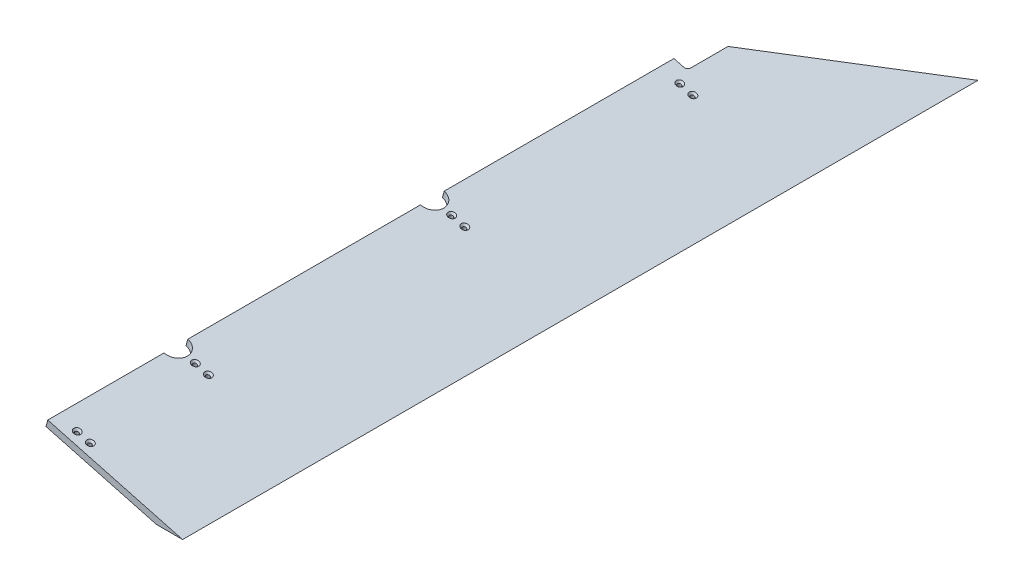
ISO-10303-21;
HEADER;
FILE_DESCRIPTION(('STEP AP214'),'2;1');
FILE_NAME('part.step','',(''),(''),'','','');
FILE_SCHEMA(('AUTOMOTIVE_DESIGN { 1 0 10303 214 1 1 1 1 }'));
ENDSEC;
DATA;
#1=APPLICATION_CONTEXT('core data for automotive mechanical design processes');
#2=APPLICATION_PROTOCOL_DEFINITION('international standard','automotive_design',2000,#1);
#3=PRODUCT_CONTEXT('',#1,'mechanical');
#4=PRODUCT('Part','Part','',(#3));
#5=PRODUCT_RELATED_PRODUCT_CATEGORY('part','',(#4));
#6=PRODUCT_DEFINITION_FORMATION('','',#4);
#7=PRODUCT_DEFINITION_CONTEXT('part definition',#1,'design');
#8=PRODUCT_DEFINITION('design','',#6,#7);
#9=PRODUCT_DEFINITION_SHAPE('','',#8);
#10=(LENGTH_UNIT() NAMED_UNIT(*) SI_UNIT(.MILLI.,.METRE.));
#11=(NAMED_UNIT(*) PLANE_ANGLE_UNIT() SI_UNIT($,.RADIAN.));
#12=(NAMED_UNIT(*) SI_UNIT($,.STERADIAN.) SOLID_ANGLE_UNIT());
#13=UNCERTAINTY_MEASURE_WITH_UNIT(LENGTH_MEASURE(1.E-05),#10,'distance_accuracy_value','');
#14=(GEOMETRIC_REPRESENTATION_CONTEXT(3) GLOBAL_UNCERTAINTY_ASSIGNED_CONTEXT((#13)) GLOBAL_UNIT_ASSIGNED_CONTEXT((#10,
#11,#12)) REPRESENTATION_CONTEXT('',''));
#15=CARTESIAN_POINT('',(0.,0.,0.));
#16=DIRECTION('',(0.,0.,1.));
#17=DIRECTION('',(1.,0.,0.));
#18=AXIS2_PLACEMENT_3D('',#15,#16,#17);
#19=CARTESIAN_POINT('',(25.512001872802,67.770934414059,1492.25));
#20=DIRECTION('',(0.965925826289068,-0.258819045102524,0.));
#21=DIRECTION('',(0.258819045102524,0.965925826289068,0.));
#22=AXIS2_PLACEMENT_3D('',#19,#20,#21);
#23=PLANE('',#22);
#24=DIRECTION('',(0.,0.,-1.));
#25=VECTOR('',#24,1.);
#26=CARTESIAN_POINT('',(25.512001872802,67.770934414059,1492.25));
#27=LINE('',#26,#25);
#28=CARTESIAN_POINT('',(25.5120018728021,67.770934414059,748.50625));
#29=VERTEX_POINT('',#28);
#30=CARTESIAN_POINT('',(25.512001872802,67.770934414059,317.5));
#31=VERTEX_POINT('',#30);
#32=EDGE_CURVE('E161',#29,#31,#27,.T.);
#33=ORIENTED_EDGE('',*,*,#32,.T.);
#34=DIRECTION('',(0.258819045102524,0.965925826289067,0.));
#35=VECTOR('',#34,1.);
#36=CARTESIAN_POINT('',(8.34908089495287,3.718041318437,317.5));
#37=LINE('',#36,#35);
#38=CARTESIAN_POINT('',(22.225,55.5036764201878,317.5));
#39=VERTEX_POINT('',#38);
#40=EDGE_CURVE('E218',#39,#31,#37,.T.);
#41=ORIENTED_EDGE('',*,*,#40,.F.);
#42=DIRECTION('',(0.,0.,-1.));
#43=VECTOR('',#42,1.);
#44=CARTESIAN_POINT('',(22.225,55.5036764201878,1492.25));
#45=LINE('',#44,#43);
#46=CARTESIAN_POINT('',(22.225,55.5036764201878,748.50625));
#47=VERTEX_POINT('',#46);
#48=EDGE_CURVE('E156',#47,#39,#45,.T.);
#49=ORIENTED_EDGE('',*,*,#48,.F.);
#50=DIRECTION('',(0.258819045102524,0.965925826289067,0.));
#51=VECTOR('',#50,1.);
#52=CARTESIAN_POINT('',(8.34908089495289,3.718041318437,748.50625));
#53=LINE('',#52,#51);
#54=EDGE_CURVE('E247',#47,#29,#53,.T.);
#55=ORIENTED_EDGE('',*,*,#54,.T.);
#56=EDGE_LOOP('',(#33,#41,#49,#55));
#57=FACE_BOUND('',#56,.T.);
#58=ADVANCED_FACE('F46',(#57),#23,.F.);
#59=CARTESIAN_POINT('',(25.5120018728021,67.770934414059,1229.51875));
#60=VERTEX_POINT('',#59);
#61=CARTESIAN_POINT('',(25.512001872802,67.770934414059,792.95625));
#62=VERTEX_POINT('',#61);
#63=EDGE_CURVE('E159',#60,#62,#27,.T.);
#64=ORIENTED_EDGE('',*,*,#63,.T.);
#65=DIRECTION('',(0.258819045102524,0.965925826289067,0.));
#66=VECTOR('',#65,1.);
#67=CARTESIAN_POINT('',(8.34908089495289,3.718041318437,792.95625));
#68=LINE('',#67,#66);
#69=CARTESIAN_POINT('',(22.225,55.5036764201878,792.95625));
#70=VERTEX_POINT('',#69);
#71=EDGE_CURVE('E244',#62,#70,#68,.F.);
#72=ORIENTED_EDGE('',*,*,#71,.T.);
#73=CARTESIAN_POINT('',(22.225,55.5036764201878,1229.51875));
#74=VERTEX_POINT('',#73);
#75=EDGE_CURVE('E168',#74,#70,#45,.T.);
#76=ORIENTED_EDGE('',*,*,#75,.F.);
#77=DIRECTION('',(0.258819045102524,0.965925826289067,0.));
#78=VECTOR('',#77,1.);
#79=CARTESIAN_POINT('',(8.34908089495289,3.718041318437,1229.51875));
#80=LINE('',#79,#78);
#81=EDGE_CURVE('E238',#74,#60,#80,.T.);
#82=ORIENTED_EDGE('',*,*,#81,.T.);
#83=EDGE_LOOP('',(#64,#72,#76,#82));
#84=FACE_BOUND('',#83,.T.);
#85=ADVANCED_FACE('F296',(#84),#23,.F.);
#86=CARTESIAN_POINT('',(25.512001872802,67.770934414059,1492.25));
#87=VERTEX_POINT('',#86);
#88=CARTESIAN_POINT('',(25.512001872802,67.770934414059,1273.96875));
#89=VERTEX_POINT('',#88);
#90=EDGE_CURVE('E154',#87,#89,#27,.T.);
#91=ORIENTED_EDGE('',*,*,#90,.T.);
#92=DIRECTION('',(0.258819045102524,0.965925826289067,0.));
#93=VECTOR('',#92,1.);
#94=CARTESIAN_POINT('',(8.34908089495289,3.718041318437,1273.96875));
#95=LINE('',#94,#93);
#96=CARTESIAN_POINT('',(22.225,55.5036764201878,1273.96875));
#97=VERTEX_POINT('',#96);
#98=EDGE_CURVE('E235',#89,#97,#95,.F.);
#99=ORIENTED_EDGE('',*,*,#98,.T.);
#100=CARTESIAN_POINT('',(22.225,55.5036764201878,1492.25));
#101=VERTEX_POINT('',#100);
#102=EDGE_CURVE('E164',#101,#97,#45,.T.);
#103=ORIENTED_EDGE('',*,*,#102,.F.);
#104=DIRECTION('',(-0.258819045102524,-0.965925826289068,0.));
#105=VECTOR('',#104,1.);
#106=CARTESIAN_POINT('',(25.512001872802,67.770934414059,1492.25));
#107=LINE('',#106,#105);
#108=EDGE_CURVE('E172',#87,#101,#107,.T.);
#109=ORIENTED_EDGE('',*,*,#108,.F.);
#110=EDGE_LOOP('',(#91,#99,#103,#109));
#111=FACE_BOUND('',#110,.T.);
#112=ADVANCED_FACE('F311',(#111),#23,.F.);
#113=CARTESIAN_POINT('',(22.225,55.5036764201878,1492.25));
#114=DIRECTION('',(0.258819045102524,0.965925826289067,0.));
#115=DIRECTION('',(-0.965925826289067,0.258819045102524,0.));
#116=AXIS2_PLACEMENT_3D('',#113,#114,#115);
#117=PLANE('',#116);
#118=CARTESIAN_POINT('',(58.5115491458709,45.7807248804393,1251.74375));
#119=DIRECTION('',(0.258819045102524,0.965925826289067,0.));
#120=DIRECTION('',(-0.965925826289067,0.258819045102524,0.));
#121=AXIS2_PLACEMENT_3D('',#118,#119,#120);
#122=CIRCLE('',#121,3.57124000000009);
#123=CARTESIAN_POINT('',(55.0619961979942,46.7050298070713,1251.74375));
#124=VERTEX_POINT('',#123);
#125=EDGE_CURVE('E204',#124,#124,#122,.T.);
#126=ORIENTED_EDGE('',*,*,#125,.T.);
#127=EDGE_LOOP('',(#126));
#128=FACE_BOUND('',#127,.T.);
#129=CARTESIAN_POINT('',(83.0460651336132,39.2067211348352,1251.74375));
#130=DIRECTION('',(0.258819045102524,0.965925826289067,0.));
#131=DIRECTION('',(-0.965925826289067,0.258819045102524,0.));
#132=AXIS2_PLACEMENT_3D('',#129,#130,#131);
#133=CIRCLE('',#132,3.57124000000009);
#134=CARTESIAN_POINT('',(79.5965121857366,40.1310260614672,1251.74375));
#135=VERTEX_POINT('',#134);
#136=EDGE_CURVE('E199',#135,#135,#133,.T.);
#137=ORIENTED_EDGE('',*,*,#136,.T.);
#138=EDGE_LOOP('',(#137));
#139=FACE_BOUND('',#138,.T.);
#140=CARTESIAN_POINT('',(58.5115491458709,45.7807248804393,770.73125));
#141=DIRECTION('',(0.258819045102524,0.965925826289067,0.));
#142=DIRECTION('',(-0.965925826289067,0.258819045102524,0.));
#143=AXIS2_PLACEMENT_3D('',#140,#141,#142);
#144=CIRCLE('',#143,3.57123999999998);
#145=CARTESIAN_POINT('',(55.0619961979943,46.7050298070713,770.73125));
#146=VERTEX_POINT('',#145);
#147=EDGE_CURVE('E194',#146,#146,#144,.T.);
#148=ORIENTED_EDGE('',*,*,#147,.T.);
#149=EDGE_LOOP('',(#148));
#150=FACE_BOUND('',#149,.T.);
#151=CARTESIAN_POINT('',(83.0460651336132,39.2067211348352,770.73125));
#152=DIRECTION('',(0.258819045102524,0.965925826289067,0.));
#153=DIRECTION('',(-0.965925826289067,0.258819045102524,0.));
#154=AXIS2_PLACEMENT_3D('',#151,#152,#153);
#155=CIRCLE('',#154,3.57123999999998);
#156=CARTESIAN_POINT('',(79.5965121857367,40.1310260614671,770.73125));
#157=VERTEX_POINT('',#156);
#158=EDGE_CURVE('E189',#157,#157,#155,.T.);
#159=ORIENTED_EDGE('',*,*,#158,.T.);
#160=EDGE_LOOP('',(#159));
#161=FACE_BOUND('',#160,.T.);
#162=CARTESIAN_POINT('',(58.5115491458709,45.7807248804393,1473.2));
#163=DIRECTION('',(0.258819045102524,0.965925826289067,0.));
#164=DIRECTION('',(-0.965925826289067,0.258819045102524,0.));
#165=AXIS2_PLACEMENT_3D('',#162,#163,#164);
#166=CIRCLE('',#165,3.57124000000009);
#167=CARTESIAN_POINT('',(55.0619961979942,46.7050298070713,1473.2));
#168=VERTEX_POINT('',#167);
#169=EDGE_CURVE('E184',#168,#168,#166,.T.);
#170=ORIENTED_EDGE('',*,*,#169,.T.);
#171=EDGE_LOOP('',(#170));
#172=FACE_BOUND('',#171,.T.);
#173=CARTESIAN_POINT('',(83.0460651336132,39.2067211348352,1473.2));
#174=DIRECTION('',(0.258819045102524,0.965925826289067,0.));
#175=DIRECTION('',(-0.965925826289067,0.258819045102524,0.));
#176=AXIS2_PLACEMENT_3D('',#173,#174,#175);
#177=CIRCLE('',#176,3.57124000000009);
#178=CARTESIAN_POINT('',(79.5965121857366,40.1310260614672,1473.2));
#179=VERTEX_POINT('',#178);
#180=EDGE_CURVE('E179',#179,#179,#177,.T.);
#181=ORIENTED_EDGE('',*,*,#180,.T.);
#182=EDGE_LOOP('',(#181));
#183=FACE_BOUND('',#182,.T.);
#184=CARTESIAN_POINT('',(58.5115491458709,45.7807248804393,342.9));
#185=DIRECTION('',(0.258819045102524,0.965925826289067,0.));
#186=DIRECTION('',(-0.965925826289067,0.258819045102524,0.));
#187=AXIS2_PLACEMENT_3D('',#184,#185,#186);
#188=CIRCLE('',#187,3.57123999999998);
#189=CARTESIAN_POINT('',(55.0619961979943,46.7050298070713,342.9));
#190=VERTEX_POINT('',#189);
#191=EDGE_CURVE('E174',#190,#190,#188,.T.);
#192=ORIENTED_EDGE('',*,*,#191,.T.);
#193=EDGE_LOOP('',(#192));
#194=FACE_BOUND('',#193,.T.);
#195=CARTESIAN_POINT('',(83.0460651336132,39.2067211348352,342.9));
#196=DIRECTION('',(0.258819045102524,0.965925826289067,0.));
#197=DIRECTION('',(-0.965925826289067,0.258819045102524,0.));
#198=AXIS2_PLACEMENT_3D('',#195,#196,#197);
#199=CIRCLE('',#198,3.57123999999998);
#200=CARTESIAN_POINT('',(79.5965121857367,40.1310260614671,342.9));
#201=VERTEX_POINT('',#200);
#202=EDGE_CURVE('E169',#201,#201,#199,.T.);
#203=ORIENTED_EDGE('',*,*,#202,.T.);
#204=EDGE_LOOP('',(#203));
#205=FACE_BOUND('',#204,.T.);
#206=DIRECTION('',(0.965925826289067,-0.258819045102524,0.));
#207=VECTOR('',#206,1.);
#208=CARTESIAN_POINT('',(22.225,55.5036764201878,317.5));
#209=LINE('',#208,#207);
#210=CARTESIAN_POINT('',(40.6258869908067,50.5731736109847,317.5));
#211=VERTEX_POINT('',#210);
#212=EDGE_CURVE('E223',#39,#211,#209,.T.);
#213=ORIENTED_EDGE('',*,*,#212,.T.);
#214=CARTESIAN_POINT('',(40.6258869908067,50.5731736109847,311.15));
#215=DIRECTION('',(0.258819045102524,0.965925826289067,0.));
#216=DIRECTION('',(-0.965925826289067,0.258819045102524,0.));
#217=AXIS2_PLACEMENT_3D('',#214,#215,#216);
#218=CIRCLE('',#217,6.35);
#219=CARTESIAN_POINT('',(46.7595159877423,48.9296726745837,311.15));
#220=VERTEX_POINT('',#219);
#221=EDGE_CURVE('E13',#211,#220,#218,.T.);
#222=ORIENTED_EDGE('',*,*,#221,.T.);
#223=DIRECTION('',(0.,0.,-1.));
#224=VECTOR('',#223,1.);
#225=CARTESIAN_POINT('',(46.7595159877423,48.9296726745837,1492.25));
#226=LINE('',#225,#224);
#227=CARTESIAN_POINT('',(46.7595159877423,48.9296726745837,240.609994719491));
#228=VERTEX_POINT('',#227);
#229=EDGE_CURVE('E149',#220,#228,#226,.T.);
#230=ORIENTED_EDGE('',*,*,#229,.T.);
#231=DIRECTION('',(0.677026360272497,-0.181408666489601,-0.71325044915418));
#232=VECTOR('',#231,1.);
#233=CARTESIAN_POINT('',(-569.697284368731,214.108774498777,890.050128130889));
#234=LINE('',#233,#232);
#235=CARTESIAN_POINT('',(229.367540407001,0.,48.2315836576664));
#236=VERTEX_POINT('',#235);
#237=EDGE_CURVE('E148',#228,#236,#234,.T.);
#238=ORIENTED_EDGE('',*,*,#237,.T.);
#239=DIRECTION('',(0.,0.,-1.));
#240=VECTOR('',#239,1.);
#241=CARTESIAN_POINT('',(229.367540407001,0.,1492.25));
#242=LINE('',#241,#240);
#243=CARTESIAN_POINT('',(229.367540407001,0.,1492.25));
#244=VERTEX_POINT('',#243);
#245=EDGE_CURVE('E147',#244,#236,#242,.T.);
#246=ORIENTED_EDGE('',*,*,#245,.F.);
#247=DIRECTION('',(0.965925826289067,-0.258819045102524,0.));
#248=VECTOR('',#247,1.);
#249=CARTESIAN_POINT('',(22.225,55.5036764201878,1492.25));
#250=LINE('',#249,#248);
#251=EDGE_CURVE('E285',#101,#244,#250,.T.);
#252=ORIENTED_EDGE('',*,*,#251,.F.);
#253=ORIENTED_EDGE('',*,*,#102,.T.);
#254=CARTESIAN_POINT('',(22.225,55.5036764201878,1251.74375));
#255=DIRECTION('',(0.258819045102524,0.965925826289067,0.));
#256=DIRECTION('',(-0.965925826289067,0.258819045102524,0.));
#257=AXIS2_PLACEMENT_3D('',#254,#255,#256);
#258=CIRCLE('',#257,22.2250000000001);
#259=EDGE_CURVE('E231',#97,#74,#258,.T.);
#260=ORIENTED_EDGE('',*,*,#259,.T.);
#261=ORIENTED_EDGE('',*,*,#75,.T.);
#262=CARTESIAN_POINT('',(22.225,55.5036764201878,770.73125));
#263=DIRECTION('',(0.258819045102524,0.965925826289067,0.));
#264=DIRECTION('',(-0.965925826289067,0.258819045102524,0.));
#265=AXIS2_PLACEMENT_3D('',#262,#263,#264);
#266=CIRCLE('',#265,22.225);
#267=EDGE_CURVE('E241',#70,#47,#266,.T.);
#268=ORIENTED_EDGE('',*,*,#267,.T.);
#269=ORIENTED_EDGE('',*,*,#48,.T.);
#270=EDGE_LOOP('',(#213,#222,#230,#238,#246,#252,#253,#260,#261,#268,#269));
#271=FACE_BOUND('',#270,.T.);
#272=ADVANCED_FACE('F306',(#128,#139,#150,#161,#172,#183,#194,#205,#271),#117,.F.);
#273=CARTESIAN_POINT('',(229.367540407001,0.,1492.25));
#274=DIRECTION('',(0.,1.,0.));
#275=DIRECTION('',(0.,0.,1.));
#276=AXIS2_PLACEMENT_3D('',#273,#274,#275);
#277=PLANE('',#276);
#278=ORIENTED_EDGE('',*,*,#245,.T.);
#279=DIRECTION('',(0.713166303643539,0.,-0.700994881113559));
#280=VECTOR('',#279,1.);
#281=CARTESIAN_POINT('',(-492.534706773972,0.,757.813314248201));
#282=LINE('',#281,#280);
#283=CARTESIAN_POINT('',(278.436572382485,0.,0.));
#284=VERTEX_POINT('',#283);
#285=EDGE_CURVE('E132',#236,#284,#282,.T.);
#286=ORIENTED_EDGE('',*,*,#285,.T.);
#287=DIRECTION('',(0.,0.,-1.));
#288=VECTOR('',#287,1.);
#289=CARTESIAN_POINT('',(278.436572382485,0.,1492.25));
#290=LINE('',#289,#288);
#291=CARTESIAN_POINT('',(278.436572382485,0.,1492.25));
#292=VERTEX_POINT('',#291);
#293=EDGE_CURVE('E144',#292,#284,#290,.T.);
#294=ORIENTED_EDGE('',*,*,#293,.F.);
#295=DIRECTION('',(1.,0.,0.));
#296=VECTOR('',#295,1.);
#297=CARTESIAN_POINT('',(229.367540407001,0.,1492.25));
#298=LINE('',#297,#296);
#299=EDGE_CURVE('E287',#244,#292,#298,.T.);
#300=ORIENTED_EDGE('',*,*,#299,.F.);
#301=EDGE_LOOP('',(#278,#286,#294,#300));
#302=FACE_BOUND('',#301,.T.);
#303=ADVANCED_FACE('F142',(#302),#277,.F.);
#304=CARTESIAN_POINT('',(278.436572382485,0.,1492.25));
#305=DIRECTION('',(-0.258819045102524,-0.965925826289068,0.));
#306=DIRECTION('',(0.965925826289068,-0.258819045102524,0.));
#307=AXIS2_PLACEMENT_3D('',#304,#305,#306);
#308=PLANE('',#307);
#309=CARTESIAN_POINT('',(61.798551018673,58.0479828743105,1251.74375));
#310=DIRECTION('',(0.258819045102524,0.965925826289068,0.));
#311=DIRECTION('',(-0.965925826289068,0.258819045102524,0.));
#312=AXIS2_PLACEMENT_3D('',#309,#310,#311);
#313=CIRCLE('',#312,6.74369999999991);
#314=CARTESIAN_POINT('',(55.2846370239275,59.7933808687684,1251.74375));
#315=VERTEX_POINT('',#314);
#316=EDGE_CURVE('E250',#315,#315,#313,.T.);
#317=ORIENTED_EDGE('',*,*,#316,.F.);
#318=EDGE_LOOP('',(#317));
#319=FACE_BOUND('',#318,.T.);
#320=CARTESIAN_POINT('',(86.3330670064153,51.4739791287064,1251.74375));
#321=DIRECTION('',(0.258819045102524,0.965925826289068,0.));
#322=DIRECTION('',(-0.965925826289068,0.258819045102524,0.));
#323=AXIS2_PLACEMENT_3D('',#320,#321,#322);
#324=CIRCLE('',#323,6.74369999999991);
#325=CARTESIAN_POINT('',(79.8191530116698,53.2193771231643,1251.74375));
#326=VERTEX_POINT('',#325);
#327=EDGE_CURVE('E207',#326,#326,#324,.T.);
#328=ORIENTED_EDGE('',*,*,#327,.F.);
#329=EDGE_LOOP('',(#328));
#330=FACE_BOUND('',#329,.T.);
#331=CARTESIAN_POINT('',(61.798551018673,58.0479828743105,770.73125));
#332=DIRECTION('',(0.258819045102524,0.965925826289068,0.));
#333=DIRECTION('',(-0.965925826289068,0.258819045102524,0.));
#334=AXIS2_PLACEMENT_3D('',#331,#332,#333);
#335=CIRCLE('',#334,6.74370000000002);
#336=CARTESIAN_POINT('',(55.2846370239274,59.7933808687684,770.73125));
#337=VERTEX_POINT('',#336);
#338=EDGE_CURVE('E202',#337,#337,#335,.T.);
#339=ORIENTED_EDGE('',*,*,#338,.F.);
#340=EDGE_LOOP('',(#339));
#341=FACE_BOUND('',#340,.T.);
#342=CARTESIAN_POINT('',(86.3330670064153,51.4739791287064,770.73125));
#343=DIRECTION('',(0.258819045102524,0.965925826289068,0.));
#344=DIRECTION('',(-0.965925826289068,0.258819045102524,0.));
#345=AXIS2_PLACEMENT_3D('',#342,#343,#344);
#346=CIRCLE('',#345,6.74370000000002);
#347=CARTESIAN_POINT('',(79.8191530116697,53.2193771231643,770.73125));
#348=VERTEX_POINT('',#347);
#349=EDGE_CURVE('E197',#348,#348,#346,.T.);
#350=ORIENTED_EDGE('',*,*,#349,.F.);
#351=EDGE_LOOP('',(#350));
#352=FACE_BOUND('',#351,.T.);
#353=CARTESIAN_POINT('',(61.798551018673,58.0479828743105,1473.2));
#354=DIRECTION('',(0.258819045102524,0.965925826289068,0.));
#355=DIRECTION('',(-0.965925826289068,0.258819045102524,0.));
#356=AXIS2_PLACEMENT_3D('',#353,#354,#355);
#357=CIRCLE('',#356,6.74369999999991);
#358=CARTESIAN_POINT('',(55.2846370239275,59.7933808687684,1473.2));
#359=VERTEX_POINT('',#358);
#360=EDGE_CURVE('E192',#359,#359,#357,.T.);
#361=ORIENTED_EDGE('',*,*,#360,.F.);
#362=EDGE_LOOP('',(#361));
#363=FACE_BOUND('',#362,.T.);
#364=CARTESIAN_POINT('',(86.3330670064153,51.4739791287064,1473.2));
#365=DIRECTION('',(0.258819045102524,0.965925826289068,0.));
#366=DIRECTION('',(-0.965925826289068,0.258819045102524,0.));
#367=AXIS2_PLACEMENT_3D('',#364,#365,#366);
#368=CIRCLE('',#367,6.74369999999991);
#369=CARTESIAN_POINT('',(79.8191530116698,53.2193771231643,1473.2));
#370=VERTEX_POINT('',#369);
#371=EDGE_CURVE('E187',#370,#370,#368,.T.);
#372=ORIENTED_EDGE('',*,*,#371,.F.);
#373=EDGE_LOOP('',(#372));
#374=FACE_BOUND('',#373,.T.);
#375=CARTESIAN_POINT('',(61.798551018673,58.0479828743105,342.9));
#376=DIRECTION('',(0.258819045102524,0.965925826289068,0.));
#377=DIRECTION('',(-0.965925826289068,0.258819045102524,0.));
#378=AXIS2_PLACEMENT_3D('',#375,#376,#377);
#379=CIRCLE('',#378,6.74370000000002);
#380=CARTESIAN_POINT('',(55.2846370239274,59.7933808687684,342.9));
#381=VERTEX_POINT('',#380);
#382=EDGE_CURVE('E182',#381,#381,#379,.T.);
#383=ORIENTED_EDGE('',*,*,#382,.F.);
#384=EDGE_LOOP('',(#383));
#385=FACE_BOUND('',#384,.T.);
#386=CARTESIAN_POINT('',(86.3330670064153,51.4739791287064,342.9));
#387=DIRECTION('',(0.258819045102524,0.965925826289068,0.));
#388=DIRECTION('',(-0.965925826289068,0.258819045102524,0.));
#389=AXIS2_PLACEMENT_3D('',#386,#387,#388);
#390=CIRCLE('',#389,6.74370000000002);
#391=CARTESIAN_POINT('',(79.8191530116697,53.2193771231643,342.9));
#392=VERTEX_POINT('',#391);
#393=EDGE_CURVE('E177',#392,#392,#390,.T.);
#394=ORIENTED_EDGE('',*,*,#393,.F.);
#395=EDGE_LOOP('',(#394));
#396=FACE_BOUND('',#395,.T.);
#397=ORIENTED_EDGE('',*,*,#293,.T.);
#398=DIRECTION('',(0.677026360272497,-0.1814086664896,-0.71325044915418));
#399=VECTOR('',#398,1.);
#400=CARTESIAN_POINT('',(50.0465178605444,61.1969306684549,240.609994719491));
#401=LINE('',#400,#399);
#402=CARTESIAN_POINT('',(50.0465178605444,61.1969306684549,240.609994719491));
#403=VERTEX_POINT('',#402);
#404=EDGE_CURVE('E128',#403,#284,#401,.T.);
#405=ORIENTED_EDGE('',*,*,#404,.F.);
#406=DIRECTION('',(0.,0.,-1.));
#407=VECTOR('',#406,1.);
#408=CARTESIAN_POINT('',(50.0465178605444,61.1969306684549,317.5));
#409=LINE('',#408,#407);
#410=CARTESIAN_POINT('',(50.0465178605444,61.1969306684549,311.15));
#411=VERTEX_POINT('',#410);
#412=EDGE_CURVE('E215',#411,#403,#409,.T.);
#413=ORIENTED_EDGE('',*,*,#412,.F.);
#414=CARTESIAN_POINT('',(43.9128888636088,62.8404316048559,311.15));
#415=DIRECTION('',(-0.258819045102524,-0.965925826289068,0.));
#416=DIRECTION('',(0.965925826289068,-0.258819045102524,0.));
#417=AXIS2_PLACEMENT_3D('',#414,#415,#416);
#418=CIRCLE('',#417,6.35);
#419=CARTESIAN_POINT('',(43.9128888636088,62.8404316048559,317.5));
#420=VERTEX_POINT('',#419);
#421=EDGE_CURVE('E54',#411,#420,#418,.T.);
#422=ORIENTED_EDGE('',*,*,#421,.T.);
#423=DIRECTION('',(0.965925826289067,-0.258819045102524,0.));
#424=VECTOR('',#423,1.);
#425=CARTESIAN_POINT('',(25.5120018728021,67.770934414059,317.5));
#426=LINE('',#425,#424);
#427=EDGE_CURVE('E137',#31,#420,#426,.T.);
#428=ORIENTED_EDGE('',*,*,#427,.F.);
#429=ORIENTED_EDGE('',*,*,#32,.F.);
#430=CARTESIAN_POINT('',(25.5120018728021,67.770934414059,770.73125));
#431=DIRECTION('',(0.258819045102524,0.965925826289068,0.));
#432=DIRECTION('',(-0.965925826289068,0.258819045102524,0.));
#433=AXIS2_PLACEMENT_3D('',#430,#431,#432);
#434=CIRCLE('',#433,22.225);
#435=EDGE_CURVE('E229',#62,#29,#434,.T.);
#436=ORIENTED_EDGE('',*,*,#435,.F.);
#437=ORIENTED_EDGE('',*,*,#63,.F.);
#438=CARTESIAN_POINT('',(25.5120018728021,67.770934414059,1251.74375));
#439=DIRECTION('',(0.258819045102524,0.965925826289068,0.));
#440=DIRECTION('',(-0.965925826289068,0.258819045102524,0.));
#441=AXIS2_PLACEMENT_3D('',#438,#439,#440);
#442=CIRCLE('',#441,22.2250000000001);
#443=EDGE_CURVE('E228',#89,#60,#442,.T.);
#444=ORIENTED_EDGE('',*,*,#443,.F.);
#445=ORIENTED_EDGE('',*,*,#90,.F.);
#446=DIRECTION('',(-0.965925826289068,0.258819045102524,0.));
#447=VECTOR('',#446,1.);
#448=CARTESIAN_POINT('',(278.436572382485,0.,1492.25));
#449=LINE('',#448,#447);
#450=EDGE_CURVE('E153',#292,#87,#449,.T.);
#451=ORIENTED_EDGE('',*,*,#450,.F.);
#452=EDGE_LOOP('',(#397,#405,#413,#422,#428,#429,#436,#437,#444,#445,#451));
#453=FACE_BOUND('',#452,.T.);
#454=ADVANCED_FACE('F151',(#319,#330,#341,#352,#363,#374,#385,#396,#453),#308,.F.);
#455=CARTESIAN_POINT('',(0.,0.,1492.25));
#456=DIRECTION('',(0.,0.,1.));
#457=DIRECTION('',(1.,0.,0.));
#458=AXIS2_PLACEMENT_3D('',#455,#456,#457);
#459=PLANE('',#458);
#460=ORIENTED_EDGE('',*,*,#108,.T.);
#461=ORIENTED_EDGE('',*,*,#251,.T.);
#462=ORIENTED_EDGE('',*,*,#299,.T.);
#463=ORIENTED_EDGE('',*,*,#450,.T.);
#464=EDGE_LOOP('',(#460,#461,#462,#463));
#465=FACE_BOUND('',#464,.T.);
#466=ADVANCED_FACE('F313',(#465),#459,.T.);
#467=CARTESIAN_POINT('',(86.3330670064153,51.4739791287064,342.9));
#468=DIRECTION('',(0.258819045102524,0.965925826289068,0.));
#469=DIRECTION('',(-0.965925826289068,0.258819045102524,0.));
#470=AXIS2_PLACEMENT_3D('',#467,#468,#469);
#471=CYLINDRICAL_SURFACE('',#470,3.57123999999998);
#472=CARTESIAN_POINT('',(85.3885074818001,47.9488349920696,342.9));
#473=DIRECTION('',(0.258819045102524,0.965925826289068,0.));
#474=DIRECTION('',(-0.965925826289068,0.258819045102524,0.));
#475=AXIS2_PLACEMENT_3D('',#472,#473,#474);
#476=CIRCLE('',#475,3.57123999999998);
#477=CARTESIAN_POINT('',(81.9389545339236,48.8731399187015,342.9));
#478=VERTEX_POINT('',#477);
#479=EDGE_CURVE('E173',#478,#478,#476,.T.);
#480=ORIENTED_EDGE('',*,*,#479,.T.);
#481=EDGE_LOOP('',(#480));
#482=FACE_BOUND('',#481,.T.);
#483=ORIENTED_EDGE('',*,*,#202,.F.);
#484=EDGE_LOOP('',(#483));
#485=FACE_BOUND('',#484,.T.);
#486=ADVANCED_FACE('F341',(#482,#485),#471,.F.);
#487=CARTESIAN_POINT('',(86.3330670064153,51.4739791287064,342.9));
#488=DIRECTION('',(0.258819045102524,0.965925826289068,0.));
#489=DIRECTION('',(-0.965925826289068,0.258819045102524,0.));
#490=AXIS2_PLACEMENT_3D('',#487,#488,#489);
#491=CONICAL_SURFACE('',#490,6.74370000000002,0.715584993317682);
#492=ORIENTED_EDGE('',*,*,#479,.F.);
#493=EDGE_LOOP('',(#492));
#494=FACE_BOUND('',#493,.T.);
#495=ORIENTED_EDGE('',*,*,#393,.T.);
#496=EDGE_LOOP('',(#495));
#497=FACE_BOUND('',#496,.T.);
#498=ADVANCED_FACE('F344',(#494,#497),#491,.F.);
#499=CARTESIAN_POINT('',(61.798551018673,58.0479828743105,342.9));
#500=DIRECTION('',(0.258819045102524,0.965925826289068,0.));
#501=DIRECTION('',(-0.965925826289068,0.258819045102524,0.));
#502=AXIS2_PLACEMENT_3D('',#499,#500,#501);
#503=CYLINDRICAL_SURFACE('',#502,3.57123999999998);
#504=CARTESIAN_POINT('',(60.8539914940578,54.5228387376737,342.9));
#505=DIRECTION('',(0.258819045102524,0.965925826289068,0.));
#506=DIRECTION('',(-0.965925826289068,0.258819045102524,0.));
#507=AXIS2_PLACEMENT_3D('',#504,#505,#506);
#508=CIRCLE('',#507,3.57123999999998);
#509=CARTESIAN_POINT('',(57.4044385461813,55.4471436643057,342.9));
#510=VERTEX_POINT('',#509);
#511=EDGE_CURVE('E178',#510,#510,#508,.T.);
#512=ORIENTED_EDGE('',*,*,#511,.T.);
#513=EDGE_LOOP('',(#512));
#514=FACE_BOUND('',#513,.T.);
#515=ORIENTED_EDGE('',*,*,#191,.F.);
#516=EDGE_LOOP('',(#515));
#517=FACE_BOUND('',#516,.T.);
#518=ADVANCED_FACE('F348',(#514,#517),#503,.F.);
#519=CARTESIAN_POINT('',(61.798551018673,58.0479828743105,342.9));
#520=DIRECTION('',(0.258819045102524,0.965925826289068,0.));
#521=DIRECTION('',(-0.965925826289068,0.258819045102524,0.));
#522=AXIS2_PLACEMENT_3D('',#519,#520,#521);
#523=CONICAL_SURFACE('',#522,6.74370000000002,0.715584993317682);
#524=ORIENTED_EDGE('',*,*,#511,.F.);
#525=EDGE_LOOP('',(#524));
#526=FACE_BOUND('',#525,.T.);
#527=ORIENTED_EDGE('',*,*,#382,.T.);
#528=EDGE_LOOP('',(#527));
#529=FACE_BOUND('',#528,.T.);
#530=ADVANCED_FACE('F352',(#526,#529),#523,.F.);
#531=CARTESIAN_POINT('',(86.3330670064153,51.4739791287064,1473.2));
#532=DIRECTION('',(0.258819045102524,0.965925826289068,0.));
#533=DIRECTION('',(-0.965925826289068,0.258819045102524,0.));
#534=AXIS2_PLACEMENT_3D('',#531,#532,#533);
#535=CYLINDRICAL_SURFACE('',#534,3.57124000000009);
#536=CARTESIAN_POINT('',(85.3885074818001,47.9488349920696,1473.2));
#537=DIRECTION('',(0.258819045102524,0.965925826289068,0.));
#538=DIRECTION('',(-0.965925826289068,0.258819045102524,0.));
#539=AXIS2_PLACEMENT_3D('',#536,#537,#538);
#540=CIRCLE('',#539,3.57124000000009);
#541=CARTESIAN_POINT('',(81.9389545339235,48.8731399187016,1473.2));
#542=VERTEX_POINT('',#541);
#543=EDGE_CURVE('E183',#542,#542,#540,.T.);
#544=ORIENTED_EDGE('',*,*,#543,.T.);
#545=EDGE_LOOP('',(#544));
#546=FACE_BOUND('',#545,.T.);
#547=ORIENTED_EDGE('',*,*,#180,.F.);
#548=EDGE_LOOP('',(#547));
#549=FACE_BOUND('',#548,.T.);
#550=ADVANCED_FACE('F356',(#546,#549),#535,.F.);
#551=CARTESIAN_POINT('',(86.3330670064153,51.4739791287064,1473.2));
#552=DIRECTION('',(0.258819045102524,0.965925826289068,0.));
#553=DIRECTION('',(-0.965925826289068,0.258819045102524,0.));
#554=AXIS2_PLACEMENT_3D('',#551,#552,#553);
#555=CONICAL_SURFACE('',#554,6.74369999999991,0.715584993317647);
#556=ORIENTED_EDGE('',*,*,#543,.F.);
#557=EDGE_LOOP('',(#556));
#558=FACE_BOUND('',#557,.T.);
#559=ORIENTED_EDGE('',*,*,#371,.T.);
#560=EDGE_LOOP('',(#559));
#561=FACE_BOUND('',#560,.T.);
#562=ADVANCED_FACE('F360',(#558,#561),#555,.F.);
#563=CARTESIAN_POINT('',(61.798551018673,58.0479828743105,1473.2));
#564=DIRECTION('',(0.258819045102524,0.965925826289068,0.));
#565=DIRECTION('',(-0.965925826289068,0.258819045102524,0.));
#566=AXIS2_PLACEMENT_3D('',#563,#564,#565);
#567=CYLINDRICAL_SURFACE('',#566,3.57124000000009);
#568=CARTESIAN_POINT('',(60.8539914940578,54.5228387376737,1473.2));
#569=DIRECTION('',(0.258819045102524,0.965925826289068,0.));
#570=DIRECTION('',(-0.965925826289068,0.258819045102524,0.));
#571=AXIS2_PLACEMENT_3D('',#568,#569,#570);
#572=CIRCLE('',#571,3.57124000000009);
#573=CARTESIAN_POINT('',(57.4044385461811,55.4471436643057,1473.2));
#574=VERTEX_POINT('',#573);
#575=EDGE_CURVE('E188',#574,#574,#572,.T.);
#576=ORIENTED_EDGE('',*,*,#575,.T.);
#577=EDGE_LOOP('',(#576));
#578=FACE_BOUND('',#577,.T.);
#579=ORIENTED_EDGE('',*,*,#169,.F.);
#580=EDGE_LOOP('',(#579));
#581=FACE_BOUND('',#580,.T.);
#582=ADVANCED_FACE('F364',(#578,#581),#567,.F.);
#583=CARTESIAN_POINT('',(61.798551018673,58.0479828743105,1473.2));
#584=DIRECTION('',(0.258819045102524,0.965925826289068,0.));
#585=DIRECTION('',(-0.965925826289068,0.258819045102524,0.));
#586=AXIS2_PLACEMENT_3D('',#583,#584,#585);
#587=CONICAL_SURFACE('',#586,6.74369999999991,0.715584993317647);
#588=ORIENTED_EDGE('',*,*,#575,.F.);
#589=EDGE_LOOP('',(#588));
#590=FACE_BOUND('',#589,.T.);
#591=ORIENTED_EDGE('',*,*,#360,.T.);
#592=EDGE_LOOP('',(#591));
#593=FACE_BOUND('',#592,.T.);
#594=ADVANCED_FACE('F368',(#590,#593),#587,.F.);
#595=CARTESIAN_POINT('',(86.3330670064153,51.4739791287064,770.73125));
#596=DIRECTION('',(0.258819045102524,0.965925826289068,0.));
#597=DIRECTION('',(-0.965925826289068,0.258819045102524,0.));
#598=AXIS2_PLACEMENT_3D('',#595,#596,#597);
#599=CYLINDRICAL_SURFACE('',#598,3.57123999999998);
#600=CARTESIAN_POINT('',(85.3885074818001,47.9488349920696,770.73125));
#601=DIRECTION('',(0.258819045102524,0.965925826289068,0.));
#602=DIRECTION('',(-0.965925826289068,0.258819045102524,0.));
#603=AXIS2_PLACEMENT_3D('',#600,#601,#602);
#604=CIRCLE('',#603,3.57123999999998);
#605=CARTESIAN_POINT('',(81.9389545339236,48.8731399187015,770.73125));
#606=VERTEX_POINT('',#605);
#607=EDGE_CURVE('E193',#606,#606,#604,.T.);
#608=ORIENTED_EDGE('',*,*,#607,.T.);
#609=EDGE_LOOP('',(#608));
#610=FACE_BOUND('',#609,.T.);
#611=ORIENTED_EDGE('',*,*,#158,.F.);
#612=EDGE_LOOP('',(#611));
#613=FACE_BOUND('',#612,.T.);
#614=ADVANCED_FACE('F372',(#610,#613),#599,.F.);
#615=CARTESIAN_POINT('',(86.3330670064153,51.4739791287064,770.73125));
#616=DIRECTION('',(0.258819045102524,0.965925826289068,0.));
#617=DIRECTION('',(-0.965925826289068,0.258819045102524,0.));
#618=AXIS2_PLACEMENT_3D('',#615,#616,#617);
#619=CONICAL_SURFACE('',#618,6.74370000000002,0.715584993317682);
#620=ORIENTED_EDGE('',*,*,#607,.F.);
#621=EDGE_LOOP('',(#620));
#622=FACE_BOUND('',#621,.T.);
#623=ORIENTED_EDGE('',*,*,#349,.T.);
#624=EDGE_LOOP('',(#623));
#625=FACE_BOUND('',#624,.T.);
#626=ADVANCED_FACE('F376',(#622,#625),#619,.F.);
#627=CARTESIAN_POINT('',(61.798551018673,58.0479828743105,770.73125));
#628=DIRECTION('',(0.258819045102524,0.965925826289068,0.));
#629=DIRECTION('',(-0.965925826289068,0.258819045102524,0.));
#630=AXIS2_PLACEMENT_3D('',#627,#628,#629);
#631=CYLINDRICAL_SURFACE('',#630,3.57123999999998);
#632=CARTESIAN_POINT('',(60.8539914940578,54.5228387376737,770.73125));
#633=DIRECTION('',(0.258819045102524,0.965925826289068,0.));
#634=DIRECTION('',(-0.965925826289068,0.258819045102524,0.));
#635=AXIS2_PLACEMENT_3D('',#632,#633,#634);
#636=CIRCLE('',#635,3.57123999999998);
#637=CARTESIAN_POINT('',(57.4044385461813,55.4471436643057,770.73125));
#638=VERTEX_POINT('',#637);
#639=EDGE_CURVE('E198',#638,#638,#636,.T.);
#640=ORIENTED_EDGE('',*,*,#639,.T.);
#641=EDGE_LOOP('',(#640));
#642=FACE_BOUND('',#641,.T.);
#643=ORIENTED_EDGE('',*,*,#147,.F.);
#644=EDGE_LOOP('',(#643));
#645=FACE_BOUND('',#644,.T.);
#646=ADVANCED_FACE('F380',(#642,#645),#631,.F.);
#647=CARTESIAN_POINT('',(61.798551018673,58.0479828743105,770.73125));
#648=DIRECTION('',(0.258819045102524,0.965925826289068,0.));
#649=DIRECTION('',(-0.965925826289068,0.258819045102524,0.));
#650=AXIS2_PLACEMENT_3D('',#647,#648,#649);
#651=CONICAL_SURFACE('',#650,6.74370000000002,0.715584993317682);
#652=ORIENTED_EDGE('',*,*,#639,.F.);
#653=EDGE_LOOP('',(#652));
#654=FACE_BOUND('',#653,.T.);
#655=ORIENTED_EDGE('',*,*,#338,.T.);
#656=EDGE_LOOP('',(#655));
#657=FACE_BOUND('',#656,.T.);
#658=ADVANCED_FACE('F384',(#654,#657),#651,.F.);
#659=CARTESIAN_POINT('',(86.3330670064153,51.4739791287064,1251.74375));
#660=DIRECTION('',(0.258819045102524,0.965925826289068,0.));
#661=DIRECTION('',(-0.965925826289068,0.258819045102524,0.));
#662=AXIS2_PLACEMENT_3D('',#659,#660,#661);
#663=CYLINDRICAL_SURFACE('',#662,3.57124000000009);
#664=CARTESIAN_POINT('',(85.3885074818001,47.9488349920696,1251.74375));
#665=DIRECTION('',(0.258819045102524,0.965925826289068,0.));
#666=DIRECTION('',(-0.965925826289068,0.258819045102524,0.));
#667=AXIS2_PLACEMENT_3D('',#664,#665,#666);
#668=CIRCLE('',#667,3.57124000000009);
#669=CARTESIAN_POINT('',(81.9389545339235,48.8731399187016,1251.74375));
#670=VERTEX_POINT('',#669);
#671=EDGE_CURVE('E203',#670,#670,#668,.T.);
#672=ORIENTED_EDGE('',*,*,#671,.T.);
#673=EDGE_LOOP('',(#672));
#674=FACE_BOUND('',#673,.T.);
#675=ORIENTED_EDGE('',*,*,#136,.F.);
#676=EDGE_LOOP('',(#675));
#677=FACE_BOUND('',#676,.T.);
#678=ADVANCED_FACE('F388',(#674,#677),#663,.F.);
#679=CARTESIAN_POINT('',(86.3330670064153,51.4739791287064,1251.74375));
#680=DIRECTION('',(0.258819045102524,0.965925826289068,0.));
#681=DIRECTION('',(-0.965925826289068,0.258819045102524,0.));
#682=AXIS2_PLACEMENT_3D('',#679,#680,#681);
#683=CONICAL_SURFACE('',#682,6.74369999999991,0.715584993317647);
#684=ORIENTED_EDGE('',*,*,#671,.F.);
#685=EDGE_LOOP('',(#684));
#686=FACE_BOUND('',#685,.T.);
#687=ORIENTED_EDGE('',*,*,#327,.T.);
#688=EDGE_LOOP('',(#687));
#689=FACE_BOUND('',#688,.T.);
#690=ADVANCED_FACE('F392',(#686,#689),#683,.F.);
#691=CARTESIAN_POINT('',(61.798551018673,58.0479828743105,1251.74375));
#692=DIRECTION('',(0.258819045102524,0.965925826289068,0.));
#693=DIRECTION('',(-0.965925826289068,0.258819045102524,0.));
#694=AXIS2_PLACEMENT_3D('',#691,#692,#693);
#695=CYLINDRICAL_SURFACE('',#694,3.57124000000009);
#696=CARTESIAN_POINT('',(60.8539914940578,54.5228387376737,1251.74375));
#697=DIRECTION('',(0.258819045102524,0.965925826289068,0.));
#698=DIRECTION('',(-0.965925826289068,0.258819045102524,0.));
#699=AXIS2_PLACEMENT_3D('',#696,#697,#698);
#700=CIRCLE('',#699,3.57124000000009);
#701=CARTESIAN_POINT('',(57.4044385461811,55.4471436643057,1251.74375));
#702=VERTEX_POINT('',#701);
#703=EDGE_CURVE('E208',#702,#702,#700,.T.);
#704=ORIENTED_EDGE('',*,*,#703,.T.);
#705=EDGE_LOOP('',(#704));
#706=FACE_BOUND('',#705,.T.);
#707=ORIENTED_EDGE('',*,*,#125,.F.);
#708=EDGE_LOOP('',(#707));
#709=FACE_BOUND('',#708,.T.);
#710=ADVANCED_FACE('F396',(#706,#709),#695,.F.);
#711=CARTESIAN_POINT('',(61.798551018673,58.0479828743105,1251.74375));
#712=DIRECTION('',(0.258819045102524,0.965925826289068,0.));
#713=DIRECTION('',(-0.965925826289068,0.258819045102524,0.));
#714=AXIS2_PLACEMENT_3D('',#711,#712,#713);
#715=CONICAL_SURFACE('',#714,6.74369999999991,0.715584993317647);
#716=ORIENTED_EDGE('',*,*,#703,.F.);
#717=EDGE_LOOP('',(#716));
#718=FACE_BOUND('',#717,.T.);
#719=ORIENTED_EDGE('',*,*,#316,.T.);
#720=EDGE_LOOP('',(#719));
#721=FACE_BOUND('',#720,.T.);
#722=ADVANCED_FACE('F400',(#718,#721),#715,.F.);
#723=CARTESIAN_POINT('',(8.34908089495287,3.718041318437,1251.74375));
#724=DIRECTION('',(0.258819045102524,0.965925826289067,0.));
#725=DIRECTION('',(-0.965925826289068,0.258819045102524,0.));
#726=AXIS2_PLACEMENT_3D('',#723,#724,#725);
#727=CYLINDRICAL_SURFACE('',#726,22.2250000000001);
#728=ORIENTED_EDGE('',*,*,#259,.F.);
#729=ORIENTED_EDGE('',*,*,#98,.F.);
#730=ORIENTED_EDGE('',*,*,#443,.T.);
#731=ORIENTED_EDGE('',*,*,#81,.F.);
#732=EDGE_LOOP('',(#728,#729,#730,#731));
#733=FACE_BOUND('',#732,.T.);
#734=ADVANCED_FACE('F309',(#733),#727,.F.);
#735=CARTESIAN_POINT('',(8.34908089495287,3.718041318437,770.73125));
#736=DIRECTION('',(0.258819045102524,0.965925826289067,0.));
#737=DIRECTION('',(-0.965925826289068,0.258819045102524,0.));
#738=AXIS2_PLACEMENT_3D('',#735,#736,#737);
#739=CYLINDRICAL_SURFACE('',#738,22.225);
#740=ORIENTED_EDGE('',*,*,#267,.F.);
#741=ORIENTED_EDGE('',*,*,#71,.F.);
#742=ORIENTED_EDGE('',*,*,#435,.T.);
#743=ORIENTED_EDGE('',*,*,#54,.F.);
#744=EDGE_LOOP('',(#740,#741,#742,#743));
#745=FACE_BOUND('',#744,.T.);
#746=ADVANCED_FACE('F302',(#745),#739,.F.);
#747=CARTESIAN_POINT('',(32.8835968826952,-2.85596242716711,240.609994719491));
#748=DIRECTION('',(0.6889470294503,-0.184602800169031,0.700909264299852));
#749=DIRECTION('',(0.713166303643539,0.,-0.700994881113559));
#750=AXIS2_PLACEMENT_3D('',#747,#748,#749);
#751=PLANE('',#750);
#752=DIRECTION('',(0.258819045102524,0.965925826289067,0.));
#753=VECTOR('',#752,1.);
#754=CARTESIAN_POINT('',(32.8835968826952,-2.85596242716711,240.609994719491));
#755=LINE('',#754,#753);
#756=EDGE_CURVE('E135',#228,#403,#755,.T.);
#757=ORIENTED_EDGE('',*,*,#756,.T.);
#758=ORIENTED_EDGE('',*,*,#404,.T.);
#759=ORIENTED_EDGE('',*,*,#285,.F.);
#760=ORIENTED_EDGE('',*,*,#237,.F.);
#761=EDGE_LOOP('',(#757,#758,#759,#760));
#762=FACE_BOUND('',#761,.T.);
#763=ADVANCED_FACE('F130',(#762),#751,.F.);
#764=CARTESIAN_POINT('',(32.8835968826952,-2.85596242716711,317.5));
#765=DIRECTION('',(0.965925826289067,-0.258819045102524,0.));
#766=DIRECTION('',(0.258819045102524,0.965925826289068,0.));
#767=AXIS2_PLACEMENT_3D('',#764,#765,#766);
#768=PLANE('',#767);
#769=ORIENTED_EDGE('',*,*,#229,.F.);
#770=DIRECTION('',(0.258819045102524,0.965925826289068,0.));
#771=VECTOR('',#770,1.);
#772=CARTESIAN_POINT('',(50.0465178605444,61.1969306684549,311.15));
#773=LINE('',#772,#771);
#774=EDGE_CURVE('E167',#220,#411,#773,.T.);
#775=ORIENTED_EDGE('',*,*,#774,.T.);
#776=ORIENTED_EDGE('',*,*,#412,.T.);
#777=ORIENTED_EDGE('',*,*,#756,.F.);
#778=EDGE_LOOP('',(#769,#775,#776,#777));
#779=FACE_BOUND('',#778,.T.);
#780=ADVANCED_FACE('F214',(#779),#768,.F.);
#781=CARTESIAN_POINT('',(8.34908089495287,3.718041318437,317.5));
#782=DIRECTION('',(0.,0.,1.));
#783=DIRECTION('',(1.,0.,0.));
#784=AXIS2_PLACEMENT_3D('',#781,#782,#783);
#785=PLANE('',#784);
#786=ORIENTED_EDGE('',*,*,#427,.T.);
#787=DIRECTION('',(0.258819045102524,0.965925826289068,0.));
#788=VECTOR('',#787,1.);
#789=CARTESIAN_POINT('',(40.6258869908067,50.5731736109847,317.5));
#790=LINE('',#789,#788);
#791=EDGE_CURVE('E61',#420,#211,#790,.F.);
#792=ORIENTED_EDGE('',*,*,#791,.T.);
#793=ORIENTED_EDGE('',*,*,#212,.F.);
#794=ORIENTED_EDGE('',*,*,#40,.T.);
#795=EDGE_LOOP('',(#786,#792,#793,#794));
#796=FACE_BOUND('',#795,.T.);
#797=ADVANCED_FACE('F315',(#796),#785,.F.);
#798=CARTESIAN_POINT('',(26.7499678857596,-1.21246149076608,311.15));
#799=DIRECTION('',(-0.258819045102524,-0.965925826289068,0.));
#800=DIRECTION('',(0.965925826289068,-0.258819045102524,0.));
#801=AXIS2_PLACEMENT_3D('',#798,#799,#800);
#802=CYLINDRICAL_SURFACE('',#801,6.35);
#803=ORIENTED_EDGE('',*,*,#221,.F.);
#804=ORIENTED_EDGE('',*,*,#791,.F.);
#805=ORIENTED_EDGE('',*,*,#421,.F.);
#806=ORIENTED_EDGE('',*,*,#774,.F.);
#807=EDGE_LOOP('',(#803,#804,#805,#806));
#808=FACE_BOUND('',#807,.T.);
#809=ADVANCED_FACE('F48',(#808),#802,.F.);
#810=CLOSED_SHELL('',(#58,#85,#112,#272,#303,#454,#466,#486,#498,#518,#530,#550,#562,#582,#594,
#614,#626,#646,#658,#678,#690,#710,#722,#734,#746,#763,#780,#797,#809));
#811=MANIFOLD_SOLID_BREP('B2',#810);
#812=ADVANCED_BREP_SHAPE_REPRESENTATION('',(#18,#811),#14);
#813=SHAPE_DEFINITION_REPRESENTATION(#9,#812);
ENDSEC;
END-ISO-10303-21;
